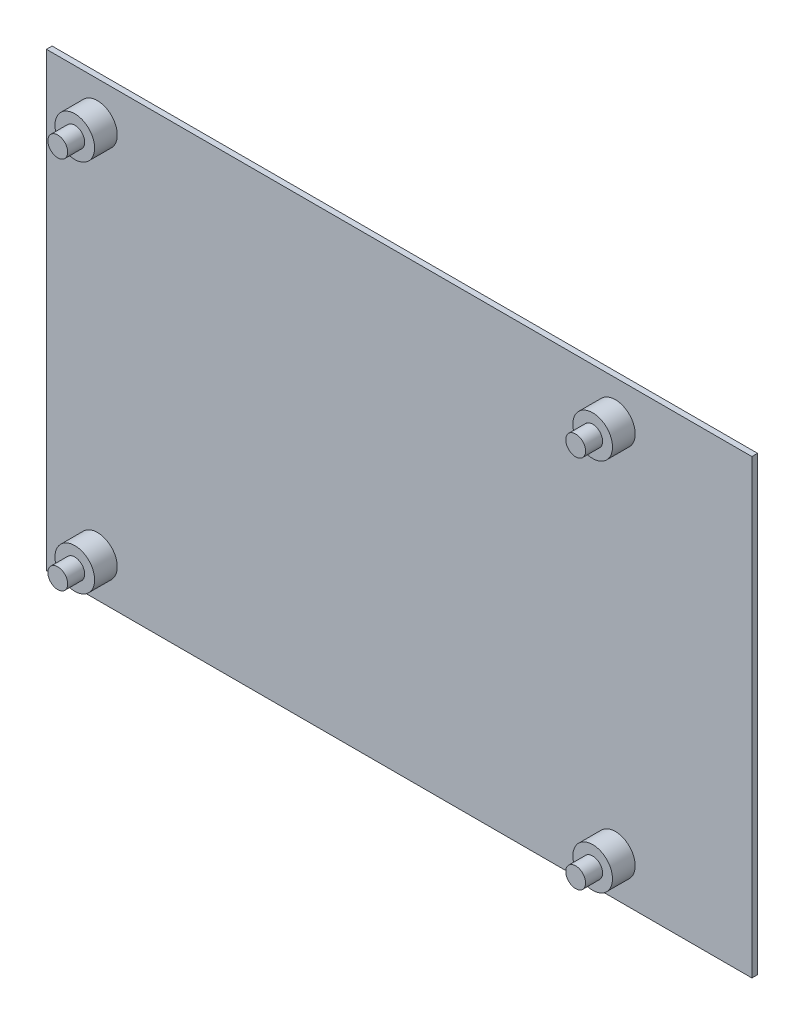
ISO-10303-21;
HEADER;
FILE_DESCRIPTION(('STEP AP214'),'2;1');
FILE_NAME('part.step','',(''),(''),'','','');
FILE_SCHEMA(('AUTOMOTIVE_DESIGN { 1 0 10303 214 1 1 1 1 }'));
ENDSEC;
DATA;
#1=APPLICATION_CONTEXT('core data for automotive mechanical design processes');
#2=APPLICATION_PROTOCOL_DEFINITION('international standard','automotive_design',2000,#1);
#3=PRODUCT_CONTEXT('',#1,'mechanical');
#4=PRODUCT('Part','Part','',(#3));
#5=PRODUCT_RELATED_PRODUCT_CATEGORY('part','',(#4));
#6=PRODUCT_DEFINITION_FORMATION('','',#4);
#7=PRODUCT_DEFINITION_CONTEXT('part definition',#1,'design');
#8=PRODUCT_DEFINITION('design','',#6,#7);
#9=PRODUCT_DEFINITION_SHAPE('','',#8);
#10=(LENGTH_UNIT() NAMED_UNIT(*) SI_UNIT(.MILLI.,.METRE.));
#11=(NAMED_UNIT(*) PLANE_ANGLE_UNIT() SI_UNIT($,.RADIAN.));
#12=(NAMED_UNIT(*) SI_UNIT($,.STERADIAN.) SOLID_ANGLE_UNIT());
#13=UNCERTAINTY_MEASURE_WITH_UNIT(LENGTH_MEASURE(1.E-05),#10,'distance_accuracy_value','');
#14=(GEOMETRIC_REPRESENTATION_CONTEXT(3) GLOBAL_UNCERTAINTY_ASSIGNED_CONTEXT((#13)) GLOBAL_UNIT_ASSIGNED_CONTEXT((#10,
#11,#12)) REPRESENTATION_CONTEXT('',''));
#15=CARTESIAN_POINT('',(0.,0.,0.));
#16=DIRECTION('',(0.,0.,1.));
#17=DIRECTION('',(1.,0.,0.));
#18=AXIS2_PLACEMENT_3D('',#15,#16,#17);
#19=CARTESIAN_POINT('',(-77.2499999999996,23.3999999999998,1.));
#20=DIRECTION('',(1.,0.,0.));
#21=DIRECTION('',(0.,0.,-1.));
#22=AXIS2_PLACEMENT_3D('',#19,#20,#21);
#23=PLANE('',#22);
#24=DIRECTION('',(0.,-1.,0.));
#25=VECTOR('',#24,1.);
#26=CARTESIAN_POINT('',(-77.2499999999996,23.3999999999998,0.));
#27=LINE('',#26,#25);
#28=CARTESIAN_POINT('',(-77.2499999999996,23.3999999999998,0.));
#29=VERTEX_POINT('',#28);
#30=CARTESIAN_POINT('',(-77.2499999999996,-56.3000000000002,0.));
#31=VERTEX_POINT('',#30);
#32=EDGE_CURVE('E100',#29,#31,#27,.T.);
#33=ORIENTED_EDGE('',*,*,#32,.T.);
#34=DIRECTION('',(0.,0.,-1.));
#35=VECTOR('',#34,1.);
#36=CARTESIAN_POINT('',(-77.2499999999996,-56.3000000000002,1.));
#37=LINE('',#36,#35);
#38=CARTESIAN_POINT('',(-77.2499999999996,-56.3000000000002,1.));
#39=VERTEX_POINT('',#38);
#40=EDGE_CURVE('E91',#39,#31,#37,.T.);
#41=ORIENTED_EDGE('',*,*,#40,.F.);
#42=DIRECTION('',(0.,-1.,0.));
#43=VECTOR('',#42,1.);
#44=CARTESIAN_POINT('',(-77.2499999999996,23.3999999999998,1.));
#45=LINE('',#44,#43);
#46=CARTESIAN_POINT('',(-77.2499999999996,23.3999999999998,1.));
#47=VERTEX_POINT('',#46);
#48=EDGE_CURVE('E85',#47,#39,#45,.T.);
#49=ORIENTED_EDGE('',*,*,#48,.F.);
#50=DIRECTION('',(0.,0.,-1.));
#51=VECTOR('',#50,1.);
#52=CARTESIAN_POINT('',(-77.2499999999996,23.3999999999998,1.));
#53=LINE('',#52,#51);
#54=EDGE_CURVE('E96',#47,#29,#53,.T.);
#55=ORIENTED_EDGE('',*,*,#54,.T.);
#56=EDGE_LOOP('',(#33,#41,#49,#55));
#57=FACE_BOUND('',#56,.T.);
#58=ADVANCED_FACE('F33',(#57),#23,.F.);
#59=CARTESIAN_POINT('',(47.2500000000004,-56.3000000000002,1.));
#60=DIRECTION('',(0.,1.,0.));
#61=DIRECTION('',(-1.,0.,0.));
#62=AXIS2_PLACEMENT_3D('',#59,#60,#61);
#63=PLANE('',#62);
#64=DIRECTION('',(1.,0.,0.));
#65=VECTOR('',#64,1.);
#66=CARTESIAN_POINT('',(47.2500000000004,-56.3000000000002,0.));
#67=LINE('',#66,#65);
#68=CARTESIAN_POINT('',(47.2500000000004,-56.3000000000002,0.));
#69=VERTEX_POINT('',#68);
#70=EDGE_CURVE('E90',#31,#69,#67,.T.);
#71=ORIENTED_EDGE('',*,*,#70,.T.);
#72=DIRECTION('',(0.,0.,-1.));
#73=VECTOR('',#72,1.);
#74=CARTESIAN_POINT('',(47.2500000000004,-56.3000000000002,1.));
#75=LINE('',#74,#73);
#76=CARTESIAN_POINT('',(47.2500000000004,-56.3000000000002,1.));
#77=VERTEX_POINT('',#76);
#78=EDGE_CURVE('E88',#77,#69,#75,.T.);
#79=ORIENTED_EDGE('',*,*,#78,.F.);
#80=DIRECTION('',(1.,0.,0.));
#81=VECTOR('',#80,1.);
#82=CARTESIAN_POINT('',(47.2500000000004,-56.3000000000002,1.));
#83=LINE('',#82,#81);
#84=EDGE_CURVE('E80',#39,#77,#83,.T.);
#85=ORIENTED_EDGE('',*,*,#84,.F.);
#86=ORIENTED_EDGE('',*,*,#40,.T.);
#87=EDGE_LOOP('',(#71,#79,#85,#86));
#88=FACE_BOUND('',#87,.T.);
#89=ADVANCED_FACE('F89',(#88),#63,.F.);
#90=CARTESIAN_POINT('',(47.2500000000004,23.3999999999998,1.));
#91=DIRECTION('',(-1.,0.,0.));
#92=DIRECTION('',(0.,-1.,0.));
#93=AXIS2_PLACEMENT_3D('',#90,#91,#92);
#94=PLANE('',#93);
#95=DIRECTION('',(0.,1.,0.));
#96=VECTOR('',#95,1.);
#97=CARTESIAN_POINT('',(47.2500000000004,23.3999999999998,0.));
#98=LINE('',#97,#96);
#99=CARTESIAN_POINT('',(47.2500000000004,23.3999999999998,0.));
#100=VERTEX_POINT('',#99);
#101=EDGE_CURVE('E66',#69,#100,#98,.T.);
#102=ORIENTED_EDGE('',*,*,#101,.T.);
#103=DIRECTION('',(0.,0.,-1.));
#104=VECTOR('',#103,1.);
#105=CARTESIAN_POINT('',(47.2500000000004,23.3999999999998,1.));
#106=LINE('',#105,#104);
#107=CARTESIAN_POINT('',(47.2500000000004,23.3999999999998,1.));
#108=VERTEX_POINT('',#107);
#109=EDGE_CURVE('E92',#108,#100,#106,.T.);
#110=ORIENTED_EDGE('',*,*,#109,.F.);
#111=DIRECTION('',(0.,1.,0.));
#112=VECTOR('',#111,1.);
#113=CARTESIAN_POINT('',(47.2500000000004,23.3999999999998,1.));
#114=LINE('',#113,#112);
#115=EDGE_CURVE('E83',#77,#108,#114,.T.);
#116=ORIENTED_EDGE('',*,*,#115,.F.);
#117=ORIENTED_EDGE('',*,*,#78,.T.);
#118=EDGE_LOOP('',(#102,#110,#116,#117));
#119=FACE_BOUND('',#118,.T.);
#120=ADVANCED_FACE('F94',(#119),#94,.F.);
#121=CARTESIAN_POINT('',(47.2500000000004,23.3999999999998,1.));
#122=DIRECTION('',(0.,-1.,0.));
#123=DIRECTION('',(1.,0.,0.));
#124=AXIS2_PLACEMENT_3D('',#121,#122,#123);
#125=PLANE('',#124);
#126=DIRECTION('',(-1.,0.,0.));
#127=VECTOR('',#126,1.);
#128=CARTESIAN_POINT('',(47.2500000000004,23.3999999999998,0.));
#129=LINE('',#128,#127);
#130=EDGE_CURVE('E72',#100,#29,#129,.T.);
#131=ORIENTED_EDGE('',*,*,#130,.T.);
#132=ORIENTED_EDGE('',*,*,#54,.F.);
#133=DIRECTION('',(-1.,0.,0.));
#134=VECTOR('',#133,1.);
#135=CARTESIAN_POINT('',(47.2500000000004,23.3999999999998,1.));
#136=LINE('',#135,#134);
#137=EDGE_CURVE('E49',#108,#47,#136,.T.);
#138=ORIENTED_EDGE('',*,*,#137,.F.);
#139=ORIENTED_EDGE('',*,*,#109,.T.);
#140=EDGE_LOOP('',(#131,#132,#138,#139));
#141=FACE_BOUND('',#140,.T.);
#142=ADVANCED_FACE('F123',(#141),#125,.F.);
#143=CARTESIAN_POINT('',(0.,0.,1.));
#144=DIRECTION('',(0.,0.,-1.));
#145=DIRECTION('',(-1.,0.,0.));
#146=AXIS2_PLACEMENT_3D('',#143,#144,#145);
#147=PLANE('',#146);
#148=CARTESIAN_POINT('',(-68.2499999999996,-49.4500000000002,1.));
#149=DIRECTION('',(0.,0.,-1.));
#150=DIRECTION('',(-1.,0.,0.));
#151=AXIS2_PLACEMENT_3D('',#148,#149,#150);
#152=CIRCLE('',#151,3.50000000000001);
#153=CARTESIAN_POINT('',(-71.7499999999996,-49.4500000000002,1.));
#154=VERTEX_POINT('',#153);
#155=EDGE_CURVE('E11',#154,#154,#152,.F.);
#156=ORIENTED_EDGE('',*,*,#155,.F.);
#157=EDGE_LOOP('',(#156));
#158=FACE_BOUND('',#157,.T.);
#159=CARTESIAN_POINT('',(23.1500000000004,-49.4500000000002,1.));
#160=DIRECTION('',(0.,0.,-1.));
#161=DIRECTION('',(-1.,0.,0.));
#162=AXIS2_PLACEMENT_3D('',#159,#160,#161);
#163=CIRCLE('',#162,3.5);
#164=CARTESIAN_POINT('',(19.6500000000004,-49.4500000000002,1.));
#165=VERTEX_POINT('',#164);
#166=EDGE_CURVE('E41',#165,#165,#163,.F.);
#167=ORIENTED_EDGE('',*,*,#166,.F.);
#168=EDGE_LOOP('',(#167));
#169=FACE_BOUND('',#168,.T.);
#170=CARTESIAN_POINT('',(23.1500000000004,16.5499999999998,1.));
#171=DIRECTION('',(0.,0.,-1.));
#172=DIRECTION('',(-1.,0.,0.));
#173=AXIS2_PLACEMENT_3D('',#170,#171,#172);
#174=CIRCLE('',#173,3.5);
#175=CARTESIAN_POINT('',(19.6500000000004,16.5499999999998,1.));
#176=VERTEX_POINT('',#175);
#177=EDGE_CURVE('E113',#176,#176,#174,.F.);
#178=ORIENTED_EDGE('',*,*,#177,.F.);
#179=EDGE_LOOP('',(#178));
#180=FACE_BOUND('',#179,.T.);
#181=CARTESIAN_POINT('',(-68.2499999999996,16.5499999999998,1.));
#182=DIRECTION('',(0.,0.,-1.));
#183=DIRECTION('',(-1.,0.,0.));
#184=AXIS2_PLACEMENT_3D('',#181,#182,#183);
#185=CIRCLE('',#184,3.50000000000001);
#186=CARTESIAN_POINT('',(-71.7499999999996,16.5499999999998,1.));
#187=VERTEX_POINT('',#186);
#188=EDGE_CURVE('E110',#187,#187,#185,.F.);
#189=ORIENTED_EDGE('',*,*,#188,.F.);
#190=EDGE_LOOP('',(#189));
#191=FACE_BOUND('',#190,.T.);
#192=ORIENTED_EDGE('',*,*,#48,.T.);
#193=ORIENTED_EDGE('',*,*,#84,.T.);
#194=ORIENTED_EDGE('',*,*,#115,.T.);
#195=ORIENTED_EDGE('',*,*,#137,.T.);
#196=EDGE_LOOP('',(#192,#193,#194,#195));
#197=FACE_BOUND('',#196,.T.);
#198=ADVANCED_FACE('F81',(#158,#169,#180,#191,#197),#147,.F.);
#199=CARTESIAN_POINT('',(0.,0.,0.));
#200=DIRECTION('',(0.,0.,-1.));
#201=DIRECTION('',(-1.,0.,0.));
#202=AXIS2_PLACEMENT_3D('',#199,#200,#201);
#203=PLANE('',#202);
#204=ORIENTED_EDGE('',*,*,#32,.F.);
#205=ORIENTED_EDGE('',*,*,#130,.F.);
#206=ORIENTED_EDGE('',*,*,#101,.F.);
#207=ORIENTED_EDGE('',*,*,#70,.F.);
#208=EDGE_LOOP('',(#204,#205,#206,#207));
#209=FACE_BOUND('',#208,.T.);
#210=ADVANCED_FACE('F122',(#209),#203,.T.);
#211=CARTESIAN_POINT('',(-68.2499999999996,16.5499999999998,5.));
#212=DIRECTION('',(0.,0.,-1.));
#213=DIRECTION('',(-1.,0.,0.));
#214=AXIS2_PLACEMENT_3D('',#211,#212,#213);
#215=CYLINDRICAL_SURFACE('',#214,3.50000000000001);
#216=CARTESIAN_POINT('',(-68.2499999999996,16.5499999999998,5.));
#217=DIRECTION('',(0.,0.,1.));
#218=DIRECTION('',(1.,0.,0.));
#219=AXIS2_PLACEMENT_3D('',#216,#217,#218);
#220=CIRCLE('',#219,3.50000000000001);
#221=CARTESIAN_POINT('',(-64.7499999999996,16.5499999999998,5.));
#222=VERTEX_POINT('',#221);
#223=EDGE_CURVE('E103',#222,#222,#220,.T.);
#224=ORIENTED_EDGE('',*,*,#223,.F.);
#225=EDGE_LOOP('',(#224));
#226=FACE_BOUND('',#225,.T.);
#227=ORIENTED_EDGE('',*,*,#188,.T.);
#228=EDGE_LOOP('',(#227));
#229=FACE_BOUND('',#228,.T.);
#230=ADVANCED_FACE('F130',(#226,#229),#215,.T.);
#231=CARTESIAN_POINT('',(-68.2499999999996,16.5499999999998,5.));
#232=DIRECTION('',(0.,0.,1.));
#233=DIRECTION('',(1.,0.,0.));
#234=AXIS2_PLACEMENT_3D('',#231,#232,#233);
#235=PLANE('',#234);
#236=CARTESIAN_POINT('',(-68.2499999999996,16.5499999999998,5.));
#237=DIRECTION('',(0.,0.,1.));
#238=DIRECTION('',(1.,0.,0.));
#239=AXIS2_PLACEMENT_3D('',#236,#237,#238);
#240=CIRCLE('',#239,1.75);
#241=CARTESIAN_POINT('',(-66.4999999999996,16.5499999999998,5.));
#242=VERTEX_POINT('',#241);
#243=EDGE_CURVE('E353',#242,#242,#240,.T.);
#244=ORIENTED_EDGE('',*,*,#243,.F.);
#245=EDGE_LOOP('',(#244));
#246=FACE_BOUND('',#245,.T.);
#247=ORIENTED_EDGE('',*,*,#223,.T.);
#248=EDGE_LOOP('',(#247));
#249=FACE_BOUND('',#248,.T.);
#250=ADVANCED_FACE('F132',(#246,#249),#235,.T.);
#251=CARTESIAN_POINT('',(23.1500000000004,16.5499999999998,5.));
#252=DIRECTION('',(0.,0.,-1.));
#253=DIRECTION('',(-1.,0.,0.));
#254=AXIS2_PLACEMENT_3D('',#251,#252,#253);
#255=CYLINDRICAL_SURFACE('',#254,3.5);
#256=CARTESIAN_POINT('',(23.1500000000004,16.5499999999998,5.));
#257=DIRECTION('',(0.,0.,1.));
#258=DIRECTION('',(1.,0.,0.));
#259=AXIS2_PLACEMENT_3D('',#256,#257,#258);
#260=CIRCLE('',#259,3.5);
#261=CARTESIAN_POINT('',(26.6500000000004,16.5499999999998,5.));
#262=VERTEX_POINT('',#261);
#263=EDGE_CURVE('E367',#262,#262,#260,.T.);
#264=ORIENTED_EDGE('',*,*,#263,.F.);
#265=EDGE_LOOP('',(#264));
#266=FACE_BOUND('',#265,.T.);
#267=ORIENTED_EDGE('',*,*,#177,.T.);
#268=EDGE_LOOP('',(#267));
#269=FACE_BOUND('',#268,.T.);
#270=ADVANCED_FACE('F139',(#266,#269),#255,.T.);
#271=CARTESIAN_POINT('',(23.1500000000004,16.5499999999998,5.));
#272=DIRECTION('',(0.,0.,1.));
#273=DIRECTION('',(1.,0.,0.));
#274=AXIS2_PLACEMENT_3D('',#271,#272,#273);
#275=PLANE('',#274);
#276=CARTESIAN_POINT('',(23.1500000000004,16.5499999999998,5.));
#277=DIRECTION('',(0.,0.,1.));
#278=DIRECTION('',(1.,0.,0.));
#279=AXIS2_PLACEMENT_3D('',#276,#277,#278);
#280=CIRCLE('',#279,1.75);
#281=CARTESIAN_POINT('',(24.9000000000004,16.5499999999998,5.));
#282=VERTEX_POINT('',#281);
#283=EDGE_CURVE('E348',#282,#282,#280,.T.);
#284=ORIENTED_EDGE('',*,*,#283,.F.);
#285=EDGE_LOOP('',(#284));
#286=FACE_BOUND('',#285,.T.);
#287=ORIENTED_EDGE('',*,*,#263,.T.);
#288=EDGE_LOOP('',(#287));
#289=FACE_BOUND('',#288,.T.);
#290=ADVANCED_FACE('F204',(#286,#289),#275,.T.);
#291=CARTESIAN_POINT('',(23.1500000000004,-49.4500000000002,5.));
#292=DIRECTION('',(0.,0.,-1.));
#293=DIRECTION('',(-1.,0.,0.));
#294=AXIS2_PLACEMENT_3D('',#291,#292,#293);
#295=CYLINDRICAL_SURFACE('',#294,3.5);
#296=CARTESIAN_POINT('',(23.1500000000004,-49.4500000000002,5.));
#297=DIRECTION('',(0.,0.,1.));
#298=DIRECTION('',(1.,0.,0.));
#299=AXIS2_PLACEMENT_3D('',#296,#297,#298);
#300=CIRCLE('',#299,3.5);
#301=CARTESIAN_POINT('',(26.6500000000004,-49.4500000000002,5.));
#302=VERTEX_POINT('',#301);
#303=EDGE_CURVE('E364',#302,#302,#300,.T.);
#304=ORIENTED_EDGE('',*,*,#303,.F.);
#305=EDGE_LOOP('',(#304));
#306=FACE_BOUND('',#305,.T.);
#307=ORIENTED_EDGE('',*,*,#166,.T.);
#308=EDGE_LOOP('',(#307));
#309=FACE_BOUND('',#308,.T.);
#310=ADVANCED_FACE('F118',(#306,#309),#295,.T.);
#311=CARTESIAN_POINT('',(23.1500000000004,-49.4500000000002,5.));
#312=DIRECTION('',(0.,0.,1.));
#313=DIRECTION('',(1.,0.,0.));
#314=AXIS2_PLACEMENT_3D('',#311,#312,#313);
#315=PLANE('',#314);
#316=CARTESIAN_POINT('',(23.1500000000004,-49.4500000000002,5.));
#317=DIRECTION('',(0.,0.,1.));
#318=DIRECTION('',(1.,0.,0.));
#319=AXIS2_PLACEMENT_3D('',#316,#317,#318);
#320=CIRCLE('',#319,1.75);
#321=CARTESIAN_POINT('',(24.9000000000004,-49.4500000000002,5.));
#322=VERTEX_POINT('',#321);
#323=EDGE_CURVE('E338',#322,#322,#320,.T.);
#324=ORIENTED_EDGE('',*,*,#323,.F.);
#325=EDGE_LOOP('',(#324));
#326=FACE_BOUND('',#325,.T.);
#327=ORIENTED_EDGE('',*,*,#303,.T.);
#328=EDGE_LOOP('',(#327));
#329=FACE_BOUND('',#328,.T.);
#330=ADVANCED_FACE('F221',(#326,#329),#315,.T.);
#331=CARTESIAN_POINT('',(-68.2499999999996,-49.4500000000002,5.));
#332=DIRECTION('',(0.,0.,-1.));
#333=DIRECTION('',(-1.,0.,0.));
#334=AXIS2_PLACEMENT_3D('',#331,#332,#333);
#335=CYLINDRICAL_SURFACE('',#334,3.50000000000001);
#336=CARTESIAN_POINT('',(-68.2499999999996,-49.4500000000002,5.));
#337=DIRECTION('',(0.,0.,1.));
#338=DIRECTION('',(1.,0.,0.));
#339=AXIS2_PLACEMENT_3D('',#336,#337,#338);
#340=CIRCLE('',#339,3.50000000000001);
#341=CARTESIAN_POINT('',(-64.7499999999996,-49.4500000000002,5.));
#342=VERTEX_POINT('',#341);
#343=EDGE_CURVE('E359',#342,#342,#340,.T.);
#344=ORIENTED_EDGE('',*,*,#343,.F.);
#345=EDGE_LOOP('',(#344));
#346=FACE_BOUND('',#345,.T.);
#347=ORIENTED_EDGE('',*,*,#155,.T.);
#348=EDGE_LOOP('',(#347));
#349=FACE_BOUND('',#348,.T.);
#350=ADVANCED_FACE('F229',(#346,#349),#335,.T.);
#351=CARTESIAN_POINT('',(-68.2499999999996,-49.4500000000002,5.));
#352=DIRECTION('',(0.,0.,1.));
#353=DIRECTION('',(1.,0.,0.));
#354=AXIS2_PLACEMENT_3D('',#351,#352,#353);
#355=PLANE('',#354);
#356=CARTESIAN_POINT('',(-68.2499999999996,-49.4500000000002,5.));
#357=DIRECTION('',(0.,0.,1.));
#358=DIRECTION('',(1.,0.,0.));
#359=AXIS2_PLACEMENT_3D('',#356,#357,#358);
#360=CIRCLE('',#359,1.75);
#361=CARTESIAN_POINT('',(-66.4999999999996,-49.4500000000002,5.));
#362=VERTEX_POINT('',#361);
#363=EDGE_CURVE('E339',#362,#362,#360,.T.);
#364=ORIENTED_EDGE('',*,*,#363,.F.);
#365=EDGE_LOOP('',(#364));
#366=FACE_BOUND('',#365,.T.);
#367=ORIENTED_EDGE('',*,*,#343,.T.);
#368=EDGE_LOOP('',(#367));
#369=FACE_BOUND('',#368,.T.);
#370=ADVANCED_FACE('F238',(#366,#369),#355,.T.);
#371=CARTESIAN_POINT('',(-68.2499999999996,16.5499999999998,8.));
#372=DIRECTION('',(0.,0.,-1.));
#373=DIRECTION('',(-1.,0.,0.));
#374=AXIS2_PLACEMENT_3D('',#371,#372,#373);
#375=CYLINDRICAL_SURFACE('',#374,1.75);
#376=CARTESIAN_POINT('',(-68.2499999999996,16.5499999999998,8.));
#377=DIRECTION('',(0.,0.,1.));
#378=DIRECTION('',(1.,0.,0.));
#379=AXIS2_PLACEMENT_3D('',#376,#377,#378);
#380=CIRCLE('',#379,1.75);
#381=CARTESIAN_POINT('',(-66.4999999999996,16.5499999999998,8.));
#382=VERTEX_POINT('',#381);
#383=EDGE_CURVE('E356',#382,#382,#380,.T.);
#384=ORIENTED_EDGE('',*,*,#383,.F.);
#385=EDGE_LOOP('',(#384));
#386=FACE_BOUND('',#385,.T.);
#387=ORIENTED_EDGE('',*,*,#243,.T.);
#388=EDGE_LOOP('',(#387));
#389=FACE_BOUND('',#388,.T.);
#390=ADVANCED_FACE('F246',(#386,#389),#375,.T.);
#391=CARTESIAN_POINT('',(-68.2499999999996,16.5499999999998,8.));
#392=DIRECTION('',(0.,0.,1.));
#393=DIRECTION('',(1.,0.,0.));
#394=AXIS2_PLACEMENT_3D('',#391,#392,#393);
#395=PLANE('',#394);
#396=ORIENTED_EDGE('',*,*,#383,.T.);
#397=EDGE_LOOP('',(#396));
#398=FACE_BOUND('',#397,.T.);
#399=ADVANCED_FACE('F255',(#398),#395,.T.);
#400=CARTESIAN_POINT('',(23.1500000000004,16.5499999999998,8.));
#401=DIRECTION('',(0.,0.,-1.));
#402=DIRECTION('',(-1.,0.,0.));
#403=AXIS2_PLACEMENT_3D('',#400,#401,#402);
#404=CYLINDRICAL_SURFACE('',#403,1.75);
#405=CARTESIAN_POINT('',(23.1500000000004,16.5499999999998,8.));
#406=DIRECTION('',(0.,0.,1.));
#407=DIRECTION('',(1.,0.,0.));
#408=AXIS2_PLACEMENT_3D('',#405,#406,#407);
#409=CIRCLE('',#408,1.75);
#410=CARTESIAN_POINT('',(24.9000000000004,16.5499999999998,8.));
#411=VERTEX_POINT('',#410);
#412=EDGE_CURVE('E350',#411,#411,#409,.T.);
#413=ORIENTED_EDGE('',*,*,#412,.F.);
#414=EDGE_LOOP('',(#413));
#415=FACE_BOUND('',#414,.T.);
#416=ORIENTED_EDGE('',*,*,#283,.T.);
#417=EDGE_LOOP('',(#416));
#418=FACE_BOUND('',#417,.T.);
#419=ADVANCED_FACE('F264',(#415,#418),#404,.T.);
#420=CARTESIAN_POINT('',(23.1500000000004,16.5499999999998,8.));
#421=DIRECTION('',(0.,0.,1.));
#422=DIRECTION('',(1.,0.,0.));
#423=AXIS2_PLACEMENT_3D('',#420,#421,#422);
#424=PLANE('',#423);
#425=ORIENTED_EDGE('',*,*,#412,.T.);
#426=EDGE_LOOP('',(#425));
#427=FACE_BOUND('',#426,.T.);
#428=ADVANCED_FACE('F273',(#427),#424,.T.);
#429=CARTESIAN_POINT('',(23.1500000000004,-49.4500000000002,8.));
#430=DIRECTION('',(0.,0.,-1.));
#431=DIRECTION('',(-1.,0.,0.));
#432=AXIS2_PLACEMENT_3D('',#429,#430,#431);
#433=CYLINDRICAL_SURFACE('',#432,1.75);
#434=CARTESIAN_POINT('',(23.1500000000004,-49.4500000000002,8.));
#435=DIRECTION('',(0.,0.,1.));
#436=DIRECTION('',(1.,0.,0.));
#437=AXIS2_PLACEMENT_3D('',#434,#435,#436);
#438=CIRCLE('',#437,1.75);
#439=CARTESIAN_POINT('',(24.9000000000004,-49.4500000000002,8.));
#440=VERTEX_POINT('',#439);
#441=EDGE_CURVE('E342',#440,#440,#438,.T.);
#442=ORIENTED_EDGE('',*,*,#441,.F.);
#443=EDGE_LOOP('',(#442));
#444=FACE_BOUND('',#443,.T.);
#445=ORIENTED_EDGE('',*,*,#323,.T.);
#446=EDGE_LOOP('',(#445));
#447=FACE_BOUND('',#446,.T.);
#448=ADVANCED_FACE('F282',(#444,#447),#433,.T.);
#449=CARTESIAN_POINT('',(23.1500000000004,-49.4500000000002,8.));
#450=DIRECTION('',(0.,0.,1.));
#451=DIRECTION('',(1.,0.,0.));
#452=AXIS2_PLACEMENT_3D('',#449,#450,#451);
#453=PLANE('',#452);
#454=ORIENTED_EDGE('',*,*,#441,.T.);
#455=EDGE_LOOP('',(#454));
#456=FACE_BOUND('',#455,.T.);
#457=ADVANCED_FACE('F291',(#456),#453,.T.);
#458=CARTESIAN_POINT('',(-68.2499999999996,-49.4500000000002,8.));
#459=DIRECTION('',(0.,0.,-1.));
#460=DIRECTION('',(-1.,0.,0.));
#461=AXIS2_PLACEMENT_3D('',#458,#459,#460);
#462=CYLINDRICAL_SURFACE('',#461,1.75);
#463=CARTESIAN_POINT('',(-68.2499999999996,-49.4500000000002,8.));
#464=DIRECTION('',(0.,0.,1.));
#465=DIRECTION('',(1.,0.,0.));
#466=AXIS2_PLACEMENT_3D('',#463,#464,#465);
#467=CIRCLE('',#466,1.75);
#468=CARTESIAN_POINT('',(-66.4999999999996,-49.4500000000002,8.));
#469=VERTEX_POINT('',#468);
#470=EDGE_CURVE('E337',#469,#469,#467,.T.);
#471=ORIENTED_EDGE('',*,*,#470,.F.);
#472=EDGE_LOOP('',(#471));
#473=FACE_BOUND('',#472,.T.);
#474=ORIENTED_EDGE('',*,*,#363,.T.);
#475=EDGE_LOOP('',(#474));
#476=FACE_BOUND('',#475,.T.);
#477=ADVANCED_FACE('F300',(#473,#476),#462,.T.);
#478=CARTESIAN_POINT('',(-68.2499999999996,-49.4500000000002,8.));
#479=DIRECTION('',(0.,0.,1.));
#480=DIRECTION('',(1.,0.,0.));
#481=AXIS2_PLACEMENT_3D('',#478,#479,#480);
#482=PLANE('',#481);
#483=ORIENTED_EDGE('',*,*,#470,.T.);
#484=EDGE_LOOP('',(#483));
#485=FACE_BOUND('',#484,.T.);
#486=ADVANCED_FACE('F309',(#485),#482,.T.);
#487=CLOSED_SHELL('',(#58,#89,#120,#142,#198,#210,#230,#250,#270,#290,#310,#330,#350,#370,#390,
#399,#419,#428,#448,#457,#477,#486));
#488=MANIFOLD_SOLID_BREP('B2',#487);
#489=ADVANCED_BREP_SHAPE_REPRESENTATION('',(#18,#488),#14);
#490=SHAPE_DEFINITION_REPRESENTATION(#9,#489);
ENDSEC;
END-ISO-10303-21;
